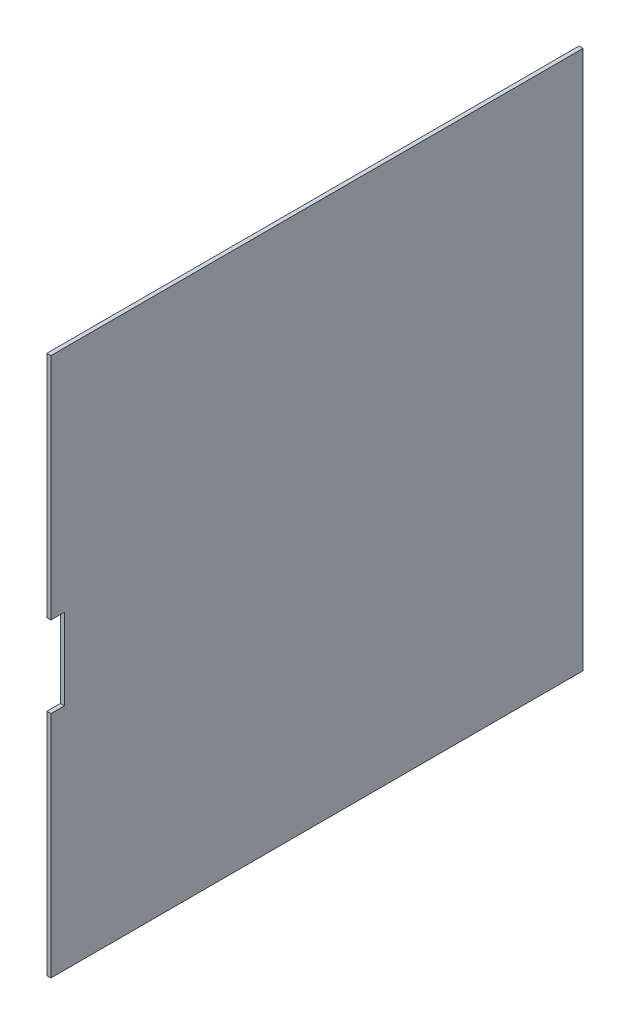
ISO-10303-21;
HEADER;
FILE_DESCRIPTION(('STEP AP214'),'2;1');
FILE_NAME('part.step','',(''),(''),'','','');
FILE_SCHEMA(('AUTOMOTIVE_DESIGN { 1 0 10303 214 1 1 1 1 }'));
ENDSEC;
DATA;
#1=APPLICATION_CONTEXT('core data for automotive mechanical design processes');
#2=APPLICATION_PROTOCOL_DEFINITION('international standard','automotive_design',2000,#1);
#3=PRODUCT_CONTEXT('',#1,'mechanical');
#4=PRODUCT('Part','Part','',(#3));
#5=PRODUCT_RELATED_PRODUCT_CATEGORY('part','',(#4));
#6=PRODUCT_DEFINITION_FORMATION('','',#4);
#7=PRODUCT_DEFINITION_CONTEXT('part definition',#1,'design');
#8=PRODUCT_DEFINITION('design','',#6,#7);
#9=PRODUCT_DEFINITION_SHAPE('','',#8);
#10=(LENGTH_UNIT() NAMED_UNIT(*) SI_UNIT(.MILLI.,.METRE.));
#11=(NAMED_UNIT(*) PLANE_ANGLE_UNIT() SI_UNIT($,.RADIAN.));
#12=(NAMED_UNIT(*) SI_UNIT($,.STERADIAN.) SOLID_ANGLE_UNIT());
#13=UNCERTAINTY_MEASURE_WITH_UNIT(LENGTH_MEASURE(1.E-05),#10,'distance_accuracy_value','');
#14=(GEOMETRIC_REPRESENTATION_CONTEXT(3) GLOBAL_UNCERTAINTY_ASSIGNED_CONTEXT((#13)) GLOBAL_UNIT_ASSIGNED_CONTEXT((#10,
#11,#12)) REPRESENTATION_CONTEXT('',''));
#15=CARTESIAN_POINT('',(0.,0.,0.));
#16=DIRECTION('',(0.,0.,1.));
#17=DIRECTION('',(1.,0.,0.));
#18=AXIS2_PLACEMENT_3D('',#15,#16,#17);
#19=CARTESIAN_POINT('',(3.,199.5,197.));
#20=DIRECTION('',(0.,0.,-1.));
#21=DIRECTION('',(0.,1.,0.));
#22=AXIS2_PLACEMENT_3D('',#19,#20,#21);
#23=PLANE('',#22);
#24=DIRECTION('',(0.,-1.,0.));
#25=VECTOR('',#24,1.);
#26=CARTESIAN_POINT('',(0.,199.5,197.));
#27=LINE('',#26,#25);
#28=CARTESIAN_POINT('',(0.,199.5,197.));
#29=VERTEX_POINT('',#28);
#30=CARTESIAN_POINT('',(0.,30.,197.));
#31=VERTEX_POINT('',#30);
#32=EDGE_CURVE('E136',#29,#31,#27,.T.);
#33=ORIENTED_EDGE('',*,*,#32,.T.);
#34=DIRECTION('',(1.,0.,0.));
#35=VECTOR('',#34,1.);
#36=CARTESIAN_POINT('',(0.,30.,197.));
#37=LINE('',#36,#35);
#38=CARTESIAN_POINT('',(3.,30.,197.));
#39=VERTEX_POINT('',#38);
#40=EDGE_CURVE('E179',#31,#39,#37,.T.);
#41=ORIENTED_EDGE('',*,*,#40,.T.);
#42=DIRECTION('',(0.,-1.,0.));
#43=VECTOR('',#42,1.);
#44=CARTESIAN_POINT('',(3.,199.5,197.));
#45=LINE('',#44,#43);
#46=CARTESIAN_POINT('',(3.,199.5,197.));
#47=VERTEX_POINT('',#46);
#48=EDGE_CURVE('E161',#47,#39,#45,.T.);
#49=ORIENTED_EDGE('',*,*,#48,.F.);
#50=DIRECTION('',(-1.,0.,0.));
#51=VECTOR('',#50,1.);
#52=CARTESIAN_POINT('',(3.,199.5,197.));
#53=LINE('',#52,#51);
#54=EDGE_CURVE('E47',#47,#29,#53,.T.);
#55=ORIENTED_EDGE('',*,*,#54,.T.);
#56=EDGE_LOOP('',(#33,#41,#49,#55));
#57=FACE_BOUND('',#56,.T.);
#58=ADVANCED_FACE('F38',(#57),#23,.F.);
#59=CARTESIAN_POINT('',(3.,199.5,-197.));
#60=DIRECTION('',(0.,0.,1.));
#61=DIRECTION('',(0.,-1.,0.));
#62=AXIS2_PLACEMENT_3D('',#59,#60,#61);
#63=PLANE('',#62);
#64=DIRECTION('',(0.,1.,0.));
#65=VECTOR('',#64,1.);
#66=CARTESIAN_POINT('',(0.,199.5,-197.));
#67=LINE('',#66,#65);
#68=CARTESIAN_POINT('',(0.,-199.5,-197.));
#69=VERTEX_POINT('',#68);
#70=CARTESIAN_POINT('',(0.,199.5,-197.));
#71=VERTEX_POINT('',#70);
#72=EDGE_CURVE('E142',#69,#71,#67,.T.);
#73=ORIENTED_EDGE('',*,*,#72,.T.);
#74=DIRECTION('',(-1.,0.,0.));
#75=VECTOR('',#74,1.);
#76=CARTESIAN_POINT('',(3.,199.5,-197.));
#77=LINE('',#76,#75);
#78=CARTESIAN_POINT('',(3.,199.5,-197.));
#79=VERTEX_POINT('',#78);
#80=EDGE_CURVE('E11',#79,#71,#77,.T.);
#81=ORIENTED_EDGE('',*,*,#80,.F.);
#82=DIRECTION('',(0.,1.,0.));
#83=VECTOR('',#82,1.);
#84=CARTESIAN_POINT('',(3.,199.5,-197.));
#85=LINE('',#84,#83);
#86=CARTESIAN_POINT('',(3.,-199.5,-197.));
#87=VERTEX_POINT('',#86);
#88=EDGE_CURVE('E148',#87,#79,#85,.T.);
#89=ORIENTED_EDGE('',*,*,#88,.F.);
#90=DIRECTION('',(-1.,0.,0.));
#91=VECTOR('',#90,1.);
#92=CARTESIAN_POINT('',(3.,-199.5,-197.));
#93=LINE('',#92,#91);
#94=EDGE_CURVE('E149',#87,#69,#93,.T.);
#95=ORIENTED_EDGE('',*,*,#94,.T.);
#96=EDGE_LOOP('',(#73,#81,#89,#95));
#97=FACE_BOUND('',#96,.T.);
#98=ADVANCED_FACE('F40',(#97),#63,.F.);
#99=CARTESIAN_POINT('',(3.,199.5,197.));
#100=DIRECTION('',(0.,-1.,0.));
#101=DIRECTION('',(0.,0.,-1.));
#102=AXIS2_PLACEMENT_3D('',#99,#100,#101);
#103=PLANE('',#102);
#104=DIRECTION('',(0.,0.,1.));
#105=VECTOR('',#104,1.);
#106=CARTESIAN_POINT('',(0.,199.5,197.));
#107=LINE('',#106,#105);
#108=EDGE_CURVE('E137',#71,#29,#107,.T.);
#109=ORIENTED_EDGE('',*,*,#108,.T.);
#110=ORIENTED_EDGE('',*,*,#54,.F.);
#111=DIRECTION('',(0.,0.,1.));
#112=VECTOR('',#111,1.);
#113=CARTESIAN_POINT('',(3.,199.5,197.));
#114=LINE('',#113,#112);
#115=EDGE_CURVE('E91',#79,#47,#114,.T.);
#116=ORIENTED_EDGE('',*,*,#115,.F.);
#117=ORIENTED_EDGE('',*,*,#80,.T.);
#118=EDGE_LOOP('',(#109,#110,#116,#117));
#119=FACE_BOUND('',#118,.T.);
#120=ADVANCED_FACE('F208',(#119),#103,.F.);
#121=CARTESIAN_POINT('',(3.,-30.,197.));
#122=VERTEX_POINT('',#121);
#123=CARTESIAN_POINT('',(3.,-199.5,197.));
#124=VERTEX_POINT('',#123);
#125=EDGE_CURVE('E129',#122,#124,#45,.T.);
#126=ORIENTED_EDGE('',*,*,#125,.F.);
#127=DIRECTION('',(1.,0.,0.));
#128=VECTOR('',#127,1.);
#129=CARTESIAN_POINT('',(0.,-30.,197.));
#130=LINE('',#129,#128);
#131=CARTESIAN_POINT('',(0.,-30.,197.));
#132=VERTEX_POINT('',#131);
#133=EDGE_CURVE('E116',#132,#122,#130,.T.);
#134=ORIENTED_EDGE('',*,*,#133,.F.);
#135=CARTESIAN_POINT('',(0.,-199.5,197.));
#136=VERTEX_POINT('',#135);
#137=EDGE_CURVE('E128',#132,#136,#27,.T.);
#138=ORIENTED_EDGE('',*,*,#137,.T.);
#139=DIRECTION('',(-1.,0.,0.));
#140=VECTOR('',#139,1.);
#141=CARTESIAN_POINT('',(3.,-199.5,197.));
#142=LINE('',#141,#140);
#143=EDGE_CURVE('E152',#124,#136,#142,.T.);
#144=ORIENTED_EDGE('',*,*,#143,.F.);
#145=EDGE_LOOP('',(#126,#134,#138,#144));
#146=FACE_BOUND('',#145,.T.);
#147=ADVANCED_FACE('F126',(#146),#23,.F.);
#148=CARTESIAN_POINT('',(3.,-199.5,197.));
#149=DIRECTION('',(0.,1.,0.));
#150=DIRECTION('',(0.,0.,1.));
#151=AXIS2_PLACEMENT_3D('',#148,#149,#150);
#152=PLANE('',#151);
#153=DIRECTION('',(0.,0.,-1.));
#154=VECTOR('',#153,1.);
#155=CARTESIAN_POINT('',(0.,-199.5,197.));
#156=LINE('',#155,#154);
#157=EDGE_CURVE('E84',#136,#69,#156,.T.);
#158=ORIENTED_EDGE('',*,*,#157,.T.);
#159=ORIENTED_EDGE('',*,*,#94,.F.);
#160=DIRECTION('',(0.,0.,-1.));
#161=VECTOR('',#160,1.);
#162=CARTESIAN_POINT('',(3.,-199.5,197.));
#163=LINE('',#162,#161);
#164=EDGE_CURVE('E63',#124,#87,#163,.T.);
#165=ORIENTED_EDGE('',*,*,#164,.F.);
#166=ORIENTED_EDGE('',*,*,#143,.T.);
#167=EDGE_LOOP('',(#158,#159,#165,#166));
#168=FACE_BOUND('',#167,.T.);
#169=ADVANCED_FACE('F199',(#168),#152,.F.);
#170=CARTESIAN_POINT('',(3.,0.,0.));
#171=DIRECTION('',(1.,0.,0.));
#172=DIRECTION('',(0.,0.,-1.));
#173=AXIS2_PLACEMENT_3D('',#170,#171,#172);
#174=PLANE('',#173);
#175=DIRECTION('',(0.,0.,1.));
#176=VECTOR('',#175,1.);
#177=CARTESIAN_POINT('',(3.,30.,197.));
#178=LINE('',#177,#176);
#179=CARTESIAN_POINT('',(3.,30.,187.));
#180=VERTEX_POINT('',#179);
#181=EDGE_CURVE('E122',#180,#39,#178,.T.);
#182=ORIENTED_EDGE('',*,*,#181,.F.);
#183=DIRECTION('',(0.,1.,0.));
#184=VECTOR('',#183,1.);
#185=CARTESIAN_POINT('',(3.,30.,187.));
#186=LINE('',#185,#184);
#187=CARTESIAN_POINT('',(3.,-30.,187.));
#188=VERTEX_POINT('',#187);
#189=EDGE_CURVE('E173',#188,#180,#186,.T.);
#190=ORIENTED_EDGE('',*,*,#189,.F.);
#191=DIRECTION('',(0.,0.,-1.));
#192=VECTOR('',#191,1.);
#193=CARTESIAN_POINT('',(3.,-30.,197.));
#194=LINE('',#193,#192);
#195=EDGE_CURVE('E170',#122,#188,#194,.T.);
#196=ORIENTED_EDGE('',*,*,#195,.F.);
#197=ORIENTED_EDGE('',*,*,#125,.T.);
#198=ORIENTED_EDGE('',*,*,#164,.T.);
#199=ORIENTED_EDGE('',*,*,#88,.T.);
#200=ORIENTED_EDGE('',*,*,#115,.T.);
#201=ORIENTED_EDGE('',*,*,#48,.T.);
#202=EDGE_LOOP('',(#182,#190,#196,#197,#198,#199,#200,#201));
#203=FACE_BOUND('',#202,.T.);
#204=ADVANCED_FACE('F201',(#203),#174,.T.);
#205=CARTESIAN_POINT('',(0.,0.,0.));
#206=DIRECTION('',(1.,0.,0.));
#207=DIRECTION('',(0.,0.,-1.));
#208=AXIS2_PLACEMENT_3D('',#205,#206,#207);
#209=PLANE('',#208);
#210=DIRECTION('',(0.,1.,0.));
#211=VECTOR('',#210,1.);
#212=CARTESIAN_POINT('',(0.,30.,187.));
#213=LINE('',#212,#211);
#214=CARTESIAN_POINT('',(0.,-30.,187.));
#215=VERTEX_POINT('',#214);
#216=CARTESIAN_POINT('',(0.,30.,187.));
#217=VERTEX_POINT('',#216);
#218=EDGE_CURVE('E54',#215,#217,#213,.T.);
#219=ORIENTED_EDGE('',*,*,#218,.T.);
#220=DIRECTION('',(0.,0.,1.));
#221=VECTOR('',#220,1.);
#222=CARTESIAN_POINT('',(0.,30.,197.));
#223=LINE('',#222,#221);
#224=EDGE_CURVE('E131',#217,#31,#223,.T.);
#225=ORIENTED_EDGE('',*,*,#224,.T.);
#226=ORIENTED_EDGE('',*,*,#32,.F.);
#227=ORIENTED_EDGE('',*,*,#108,.F.);
#228=ORIENTED_EDGE('',*,*,#72,.F.);
#229=ORIENTED_EDGE('',*,*,#157,.F.);
#230=ORIENTED_EDGE('',*,*,#137,.F.);
#231=DIRECTION('',(0.,0.,-1.));
#232=VECTOR('',#231,1.);
#233=CARTESIAN_POINT('',(0.,-30.,197.));
#234=LINE('',#233,#232);
#235=EDGE_CURVE('E112',#132,#215,#234,.T.);
#236=ORIENTED_EDGE('',*,*,#235,.T.);
#237=EDGE_LOOP('',(#219,#225,#226,#227,#228,#229,#230,#236));
#238=FACE_BOUND('',#237,.T.);
#239=ADVANCED_FACE('F133',(#238),#209,.F.);
#240=CARTESIAN_POINT('',(0.,30.,197.));
#241=DIRECTION('',(0.,1.,0.));
#242=DIRECTION('',(0.,0.,1.));
#243=AXIS2_PLACEMENT_3D('',#240,#241,#242);
#244=PLANE('',#243);
#245=ORIENTED_EDGE('',*,*,#181,.T.);
#246=ORIENTED_EDGE('',*,*,#40,.F.);
#247=ORIENTED_EDGE('',*,*,#224,.F.);
#248=DIRECTION('',(1.,0.,0.));
#249=VECTOR('',#248,1.);
#250=CARTESIAN_POINT('',(0.,30.,187.));
#251=LINE('',#250,#249);
#252=EDGE_CURVE('E182',#217,#180,#251,.T.);
#253=ORIENTED_EDGE('',*,*,#252,.T.);
#254=EDGE_LOOP('',(#245,#246,#247,#253));
#255=FACE_BOUND('',#254,.T.);
#256=ADVANCED_FACE('F242',(#255),#244,.F.);
#257=CARTESIAN_POINT('',(0.,30.,187.));
#258=DIRECTION('',(0.,0.,-1.));
#259=DIRECTION('',(-1.,0.,0.));
#260=AXIS2_PLACEMENT_3D('',#257,#258,#259);
#261=PLANE('',#260);
#262=ORIENTED_EDGE('',*,*,#189,.T.);
#263=ORIENTED_EDGE('',*,*,#252,.F.);
#264=ORIENTED_EDGE('',*,*,#218,.F.);
#265=DIRECTION('',(1.,0.,0.));
#266=VECTOR('',#265,1.);
#267=CARTESIAN_POINT('',(0.,-30.,187.));
#268=LINE('',#267,#266);
#269=EDGE_CURVE('E118',#215,#188,#268,.T.);
#270=ORIENTED_EDGE('',*,*,#269,.T.);
#271=EDGE_LOOP('',(#262,#263,#264,#270));
#272=FACE_BOUND('',#271,.T.);
#273=ADVANCED_FACE('F250',(#272),#261,.F.);
#274=CARTESIAN_POINT('',(0.,-30.,197.));
#275=DIRECTION('',(0.,-1.,0.));
#276=DIRECTION('',(0.,0.,-1.));
#277=AXIS2_PLACEMENT_3D('',#274,#275,#276);
#278=PLANE('',#277);
#279=ORIENTED_EDGE('',*,*,#195,.T.);
#280=ORIENTED_EDGE('',*,*,#269,.F.);
#281=ORIENTED_EDGE('',*,*,#235,.F.);
#282=ORIENTED_EDGE('',*,*,#133,.T.);
#283=EDGE_LOOP('',(#279,#280,#281,#282));
#284=FACE_BOUND('',#283,.T.);
#285=ADVANCED_FACE('F115',(#284),#278,.F.);
#286=CLOSED_SHELL('',(#58,#98,#120,#147,#169,#204,#239,#256,#273,#285));
#287=MANIFOLD_SOLID_BREP('B2',#286);
#288=ADVANCED_BREP_SHAPE_REPRESENTATION('',(#18,#287),#14);
#289=SHAPE_DEFINITION_REPRESENTATION(#9,#288);
ENDSEC;
END-ISO-10303-21;
